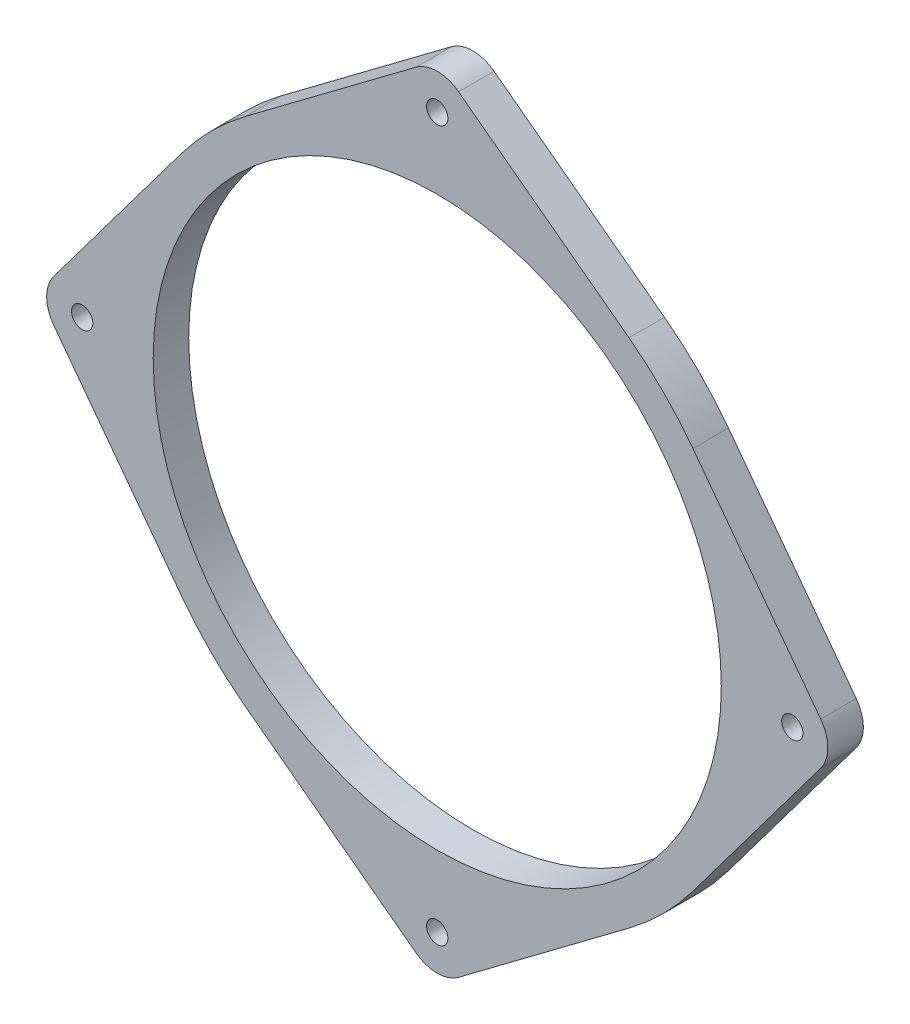
ISO-10303-21;
HEADER;
FILE_DESCRIPTION(('STEP AP214'),'2;1');
FILE_NAME('part.step','',(''),(''),'','','');
FILE_SCHEMA(('AUTOMOTIVE_DESIGN { 1 0 10303 214 1 1 1 1 }'));
ENDSEC;
DATA;
#1=APPLICATION_CONTEXT('core data for automotive mechanical design processes');
#2=APPLICATION_PROTOCOL_DEFINITION('international standard','automotive_design',2000,#1);
#3=PRODUCT_CONTEXT('',#1,'mechanical');
#4=PRODUCT('Part','Part','',(#3));
#5=PRODUCT_RELATED_PRODUCT_CATEGORY('part','',(#4));
#6=PRODUCT_DEFINITION_FORMATION('','',#4);
#7=PRODUCT_DEFINITION_CONTEXT('part definition',#1,'design');
#8=PRODUCT_DEFINITION('design','',#6,#7);
#9=PRODUCT_DEFINITION_SHAPE('','',#8);
#10=(LENGTH_UNIT() NAMED_UNIT(*) SI_UNIT(.MILLI.,.METRE.));
#11=(NAMED_UNIT(*) PLANE_ANGLE_UNIT() SI_UNIT($,.RADIAN.));
#12=(NAMED_UNIT(*) SI_UNIT($,.STERADIAN.) SOLID_ANGLE_UNIT());
#13=UNCERTAINTY_MEASURE_WITH_UNIT(LENGTH_MEASURE(1.E-05),#10,'distance_accuracy_value','');
#14=(GEOMETRIC_REPRESENTATION_CONTEXT(3) GLOBAL_UNCERTAINTY_ASSIGNED_CONTEXT((#13)) GLOBAL_UNIT_ASSIGNED_CONTEXT((#10,
#11,#12)) REPRESENTATION_CONTEXT('',''));
#15=CARTESIAN_POINT('',(0.,0.,0.));
#16=DIRECTION('',(0.,0.,1.));
#17=DIRECTION('',(1.,0.,0.));
#18=AXIS2_PLACEMENT_3D('',#15,#16,#17);
#19=CARTESIAN_POINT('',(36.,-27.,5.));
#20=DIRECTION('',(0.8,-0.6,0.));
#21=DIRECTION('',(0.6,0.8,0.));
#22=AXIS2_PLACEMENT_3D('',#19,#20,#21);
#23=PLANE('',#22);
#24=DIRECTION('',(-0.6,-0.8,0.));
#25=VECTOR('',#24,1.);
#26=CARTESIAN_POINT('',(36.,-27.,0.));
#27=LINE('',#26,#25);
#28=CARTESIAN_POINT('',(54.0000000000062,-2.9999999999918,0.));
#29=VERTEX_POINT('',#28);
#30=CARTESIAN_POINT('',(36.0000000000062,-26.9999999999918,0.));
#31=VERTEX_POINT('',#30);
#32=EDGE_CURVE('E242',#29,#31,#27,.T.);
#33=ORIENTED_EDGE('',*,*,#32,.F.);
#34=DIRECTION('',(0.,0.,-1.));
#35=VECTOR('',#34,1.);
#36=CARTESIAN_POINT('',(54.0000000000062,-2.9999999999918,5.));
#37=LINE('',#36,#35);
#38=CARTESIAN_POINT('',(54.0000000000062,-2.9999999999918,5.));
#39=VERTEX_POINT('',#38);
#40=EDGE_CURVE('E11',#39,#29,#37,.T.);
#41=ORIENTED_EDGE('',*,*,#40,.F.);
#42=DIRECTION('',(-0.6,-0.8,0.));
#43=VECTOR('',#42,1.);
#44=CARTESIAN_POINT('',(36.,-27.,5.));
#45=LINE('',#44,#43);
#46=CARTESIAN_POINT('',(36.0000000000062,-26.9999999999918,5.));
#47=VERTEX_POINT('',#46);
#48=EDGE_CURVE('E411',#39,#47,#45,.T.);
#49=ORIENTED_EDGE('',*,*,#48,.T.);
#50=DIRECTION('',(0.,0.,-1.));
#51=VECTOR('',#50,1.);
#52=CARTESIAN_POINT('',(36.0000000000062,-26.9999999999918,5.));
#53=LINE('',#52,#51);
#54=EDGE_CURVE('E115',#47,#31,#53,.T.);
#55=ORIENTED_EDGE('',*,*,#54,.T.);
#56=EDGE_LOOP('',(#33,#41,#49,#55));
#57=FACE_BOUND('',#56,.T.);
#58=ADVANCED_FACE('F39',(#57),#23,.T.);
#59=CARTESIAN_POINT('',(50.0000000000062,8.19401804060627E-12,5.));
#60=DIRECTION('',(0.,0.,-1.));
#61=DIRECTION('',(-1.,0.,0.));
#62=AXIS2_PLACEMENT_3D('',#59,#60,#61);
#63=CYLINDRICAL_SURFACE('',#62,4.99999999999999);
#64=CARTESIAN_POINT('',(50.0000000000062,8.19401804060627E-12,0.));
#65=DIRECTION('',(0.,0.,1.));
#66=DIRECTION('',(1.,0.,0.));
#67=AXIS2_PLACEMENT_3D('',#64,#65,#66);
#68=CIRCLE('',#67,4.99999999999999);
#69=CARTESIAN_POINT('',(54.0000000000062,3.00000000000819,0.));
#70=VERTEX_POINT('',#69);
#71=EDGE_CURVE('E239',#29,#70,#68,.T.);
#72=ORIENTED_EDGE('',*,*,#71,.T.);
#73=DIRECTION('',(0.,0.,-1.));
#74=VECTOR('',#73,1.);
#75=CARTESIAN_POINT('',(54.0000000000062,3.00000000000819,5.));
#76=LINE('',#75,#74);
#77=CARTESIAN_POINT('',(54.0000000000062,3.00000000000819,5.));
#78=VERTEX_POINT('',#77);
#79=EDGE_CURVE('E49',#78,#70,#76,.T.);
#80=ORIENTED_EDGE('',*,*,#79,.F.);
#81=CARTESIAN_POINT('',(50.0000000000062,8.19401804060627E-12,5.));
#82=DIRECTION('',(0.,0.,1.));
#83=DIRECTION('',(1.,0.,0.));
#84=AXIS2_PLACEMENT_3D('',#81,#82,#83);
#85=CIRCLE('',#84,4.99999999999999);
#86=EDGE_CURVE('E415',#39,#78,#85,.T.);
#87=ORIENTED_EDGE('',*,*,#86,.F.);
#88=ORIENTED_EDGE('',*,*,#40,.T.);
#89=EDGE_LOOP('',(#72,#80,#87,#88));
#90=FACE_BOUND('',#89,.T.);
#91=ADVANCED_FACE('F240',(#90),#63,.T.);
#92=CARTESIAN_POINT('',(36.0000000000079,27.0000000000059,5.));
#93=DIRECTION('',(-0.8,-0.6,0.));
#94=DIRECTION('',(0.6,-0.8,0.));
#95=AXIS2_PLACEMENT_3D('',#92,#93,#94);
#96=PLANE('',#95);
#97=DIRECTION('',(-0.6,0.8,0.));
#98=VECTOR('',#97,1.);
#99=CARTESIAN_POINT('',(36.0000000000079,27.0000000000059,0.));
#100=LINE('',#99,#98);
#101=CARTESIAN_POINT('',(36.0000000000022,27.0000000000052,0.));
#102=VERTEX_POINT('',#101);
#103=EDGE_CURVE('E233',#70,#102,#100,.T.);
#104=ORIENTED_EDGE('',*,*,#103,.T.);
#105=DIRECTION('',(0.,0.,-1.));
#106=VECTOR('',#105,1.);
#107=CARTESIAN_POINT('',(36.0000000000022,27.0000000000052,5.));
#108=LINE('',#107,#106);
#109=CARTESIAN_POINT('',(36.0000000000022,27.0000000000052,5.));
#110=VERTEX_POINT('',#109);
#111=EDGE_CURVE('E222',#110,#102,#108,.T.);
#112=ORIENTED_EDGE('',*,*,#111,.F.);
#113=DIRECTION('',(-0.6,0.8,0.));
#114=VECTOR('',#113,1.);
#115=CARTESIAN_POINT('',(36.0000000000079,27.0000000000059,5.));
#116=LINE('',#115,#114);
#117=EDGE_CURVE('E235',#78,#110,#116,.T.);
#118=ORIENTED_EDGE('',*,*,#117,.F.);
#119=ORIENTED_EDGE('',*,*,#79,.T.);
#120=EDGE_LOOP('',(#104,#112,#118,#119));
#121=FACE_BOUND('',#120,.T.);
#122=ADVANCED_FACE('F231',(#121),#96,.F.);
#123=CARTESIAN_POINT('',(0.,0.,5.));
#124=DIRECTION('',(0.,0.,-1.));
#125=DIRECTION('',(-1.,0.,0.));
#126=AXIS2_PLACEMENT_3D('',#123,#124,#125);
#127=CYLINDRICAL_SURFACE('',#126,45.);
#128=CARTESIAN_POINT('',(0.,0.,0.));
#129=DIRECTION('',(0.,0.,1.));
#130=DIRECTION('',(1.,0.,0.));
#131=AXIS2_PLACEMENT_3D('',#128,#129,#130);
#132=CIRCLE('',#131,45.);
#133=CARTESIAN_POINT('',(26.9999999999974,36.0000000000051,0.));
#134=VERTEX_POINT('',#133);
#135=EDGE_CURVE('E246',#102,#134,#132,.T.);
#136=ORIENTED_EDGE('',*,*,#135,.T.);
#137=DIRECTION('',(0.,0.,-1.));
#138=VECTOR('',#137,1.);
#139=CARTESIAN_POINT('',(26.9999999999974,36.0000000000051,5.));
#140=LINE('',#139,#138);
#141=CARTESIAN_POINT('',(26.9999999999974,36.0000000000051,5.));
#142=VERTEX_POINT('',#141);
#143=EDGE_CURVE('E219',#142,#134,#140,.T.);
#144=ORIENTED_EDGE('',*,*,#143,.F.);
#145=CARTESIAN_POINT('',(0.,0.,5.));
#146=DIRECTION('',(0.,0.,1.));
#147=DIRECTION('',(1.,0.,0.));
#148=AXIS2_PLACEMENT_3D('',#145,#146,#147);
#149=CIRCLE('',#148,45.);
#150=EDGE_CURVE('E423',#110,#142,#149,.T.);
#151=ORIENTED_EDGE('',*,*,#150,.F.);
#152=ORIENTED_EDGE('',*,*,#111,.T.);
#153=EDGE_LOOP('',(#136,#144,#151,#152));
#154=FACE_BOUND('',#153,.T.);
#155=ADVANCED_FACE('F352',(#154),#127,.T.);
#156=CARTESIAN_POINT('',(27.0000000000031,36.0000000000041,5.));
#157=DIRECTION('',(0.6,0.8,0.));
#158=DIRECTION('',(-0.8,0.6,0.));
#159=AXIS2_PLACEMENT_3D('',#156,#157,#158);
#160=PLANE('',#159);
#161=DIRECTION('',(0.8,-0.6,0.));
#162=VECTOR('',#161,1.);
#163=CARTESIAN_POINT('',(27.0000000000031,36.0000000000041,0.));
#164=LINE('',#163,#162);
#165=CARTESIAN_POINT('',(2.99999999999898,54.0000000000072,0.));
#166=VERTEX_POINT('',#165);
#167=EDGE_CURVE('E255',#166,#134,#164,.T.);
#168=ORIENTED_EDGE('',*,*,#167,.F.);
#169=DIRECTION('',(0.,0.,-1.));
#170=VECTOR('',#169,1.);
#171=CARTESIAN_POINT('',(2.99999999999898,54.0000000000072,5.));
#172=LINE('',#171,#170);
#173=CARTESIAN_POINT('',(2.99999999999898,54.0000000000072,5.));
#174=VERTEX_POINT('',#173);
#175=EDGE_CURVE('E216',#174,#166,#172,.T.);
#176=ORIENTED_EDGE('',*,*,#175,.F.);
#177=DIRECTION('',(0.8,-0.6,0.));
#178=VECTOR('',#177,1.);
#179=CARTESIAN_POINT('',(27.0000000000031,36.0000000000041,5.));
#180=LINE('',#179,#178);
#181=EDGE_CURVE('E426',#174,#142,#180,.T.);
#182=ORIENTED_EDGE('',*,*,#181,.T.);
#183=ORIENTED_EDGE('',*,*,#143,.T.);
#184=EDGE_LOOP('',(#168,#176,#182,#183));
#185=FACE_BOUND('',#184,.T.);
#186=ADVANCED_FACE('F353',(#185),#160,.T.);
#187=CARTESIAN_POINT('',(-1.00920123306442E-12,50.0000000000072,5.));
#188=DIRECTION('',(0.,0.,-1.));
#189=DIRECTION('',(-1.,0.,0.));
#190=AXIS2_PLACEMENT_3D('',#187,#188,#189);
#191=CYLINDRICAL_SURFACE('',#190,4.99999999999999);
#192=CARTESIAN_POINT('',(-1.00920123306442E-12,50.0000000000072,0.));
#193=DIRECTION('',(0.,0.,1.));
#194=DIRECTION('',(1.,0.,0.));
#195=AXIS2_PLACEMENT_3D('',#192,#193,#194);
#196=CIRCLE('',#195,4.99999999999999);
#197=CARTESIAN_POINT('',(-3.000000000001,54.0000000000072,0.));
#198=VERTEX_POINT('',#197);
#199=EDGE_CURVE('E260',#166,#198,#196,.T.);
#200=ORIENTED_EDGE('',*,*,#199,.T.);
#201=DIRECTION('',(0.,0.,-1.));
#202=VECTOR('',#201,1.);
#203=CARTESIAN_POINT('',(-3.000000000001,54.0000000000072,5.));
#204=LINE('',#203,#202);
#205=CARTESIAN_POINT('',(-3.000000000001,54.0000000000072,5.));
#206=VERTEX_POINT('',#205);
#207=EDGE_CURVE('E212',#206,#198,#204,.T.);
#208=ORIENTED_EDGE('',*,*,#207,.F.);
#209=CARTESIAN_POINT('',(-1.00920123306442E-12,50.0000000000072,5.));
#210=DIRECTION('',(0.,0.,1.));
#211=DIRECTION('',(1.,0.,0.));
#212=AXIS2_PLACEMENT_3D('',#209,#210,#211);
#213=CIRCLE('',#212,4.99999999999999);
#214=EDGE_CURVE('E431',#174,#206,#213,.T.);
#215=ORIENTED_EDGE('',*,*,#214,.F.);
#216=ORIENTED_EDGE('',*,*,#175,.T.);
#217=EDGE_LOOP('',(#200,#208,#215,#216));
#218=FACE_BOUND('',#217,.T.);
#219=ADVANCED_FACE('F356',(#218),#191,.T.);
#220=CARTESIAN_POINT('',(-27.0000000000038,36.0000000000051,5.));
#221=DIRECTION('',(0.6,-0.8,0.));
#222=DIRECTION('',(0.8,0.6,0.));
#223=AXIS2_PLACEMENT_3D('',#220,#221,#222);
#224=PLANE('',#223);
#225=DIRECTION('',(-0.8,-0.6,0.));
#226=VECTOR('',#225,1.);
#227=CARTESIAN_POINT('',(-27.0000000000038,36.0000000000051,0.));
#228=LINE('',#227,#226);
#229=CARTESIAN_POINT('',(-26.9999999999991,36.0000000000046,0.));
#230=VERTEX_POINT('',#229);
#231=EDGE_CURVE('E264',#198,#230,#228,.T.);
#232=ORIENTED_EDGE('',*,*,#231,.T.);
#233=DIRECTION('',(0.,0.,-1.));
#234=VECTOR('',#233,1.);
#235=CARTESIAN_POINT('',(-26.9999999999991,36.0000000000046,5.));
#236=LINE('',#235,#234);
#237=CARTESIAN_POINT('',(-26.9999999999991,36.0000000000046,5.));
#238=VERTEX_POINT('',#237);
#239=EDGE_CURVE('E208',#238,#230,#236,.T.);
#240=ORIENTED_EDGE('',*,*,#239,.F.);
#241=DIRECTION('',(-0.8,-0.6,0.));
#242=VECTOR('',#241,1.);
#243=CARTESIAN_POINT('',(-27.0000000000038,36.0000000000051,5.));
#244=LINE('',#243,#242);
#245=EDGE_CURVE('E435',#206,#238,#244,.T.);
#246=ORIENTED_EDGE('',*,*,#245,.F.);
#247=ORIENTED_EDGE('',*,*,#207,.T.);
#248=EDGE_LOOP('',(#232,#240,#246,#247));
#249=FACE_BOUND('',#248,.T.);
#250=ADVANCED_FACE('F360',(#249),#224,.F.);
#251=CARTESIAN_POINT('',(-36.,27.,0.));
#252=VERTEX_POINT('',#251);
#253=EDGE_CURVE('E256',#230,#252,#132,.T.);
#254=ORIENTED_EDGE('',*,*,#253,.T.);
#255=DIRECTION('',(0.,0.,-1.));
#256=VECTOR('',#255,1.);
#257=CARTESIAN_POINT('',(-36.,27.,5.));
#258=LINE('',#257,#256);
#259=CARTESIAN_POINT('',(-36.,27.,5.));
#260=VERTEX_POINT('',#259);
#261=EDGE_CURVE('E205',#260,#252,#258,.T.);
#262=ORIENTED_EDGE('',*,*,#261,.F.);
#263=EDGE_CURVE('E427',#238,#260,#149,.T.);
#264=ORIENTED_EDGE('',*,*,#263,.F.);
#265=ORIENTED_EDGE('',*,*,#239,.T.);
#266=EDGE_LOOP('',(#254,#262,#264,#265));
#267=FACE_BOUND('',#266,.T.);
#268=ADVANCED_FACE('F364',(#267),#127,.T.);
#269=CARTESIAN_POINT('',(-36.,27.,5.));
#270=DIRECTION('',(-0.8,0.6,0.));
#271=DIRECTION('',(-0.6,-0.8,0.));
#272=AXIS2_PLACEMENT_3D('',#269,#270,#271);
#273=PLANE('',#272);
#274=DIRECTION('',(0.6,0.8,0.));
#275=VECTOR('',#274,1.);
#276=CARTESIAN_POINT('',(-36.,27.,0.));
#277=LINE('',#276,#275);
#278=CARTESIAN_POINT('',(-54.,3.,0.));
#279=VERTEX_POINT('',#278);
#280=EDGE_CURVE('E268',#279,#252,#277,.T.);
#281=ORIENTED_EDGE('',*,*,#280,.F.);
#282=DIRECTION('',(0.,0.,-1.));
#283=VECTOR('',#282,1.);
#284=CARTESIAN_POINT('',(-54.,3.,5.));
#285=LINE('',#284,#283);
#286=CARTESIAN_POINT('',(-54.,3.,5.));
#287=VERTEX_POINT('',#286);
#288=EDGE_CURVE('E202',#287,#279,#285,.T.);
#289=ORIENTED_EDGE('',*,*,#288,.F.);
#290=DIRECTION('',(0.6,0.8,0.));
#291=VECTOR('',#290,1.);
#292=CARTESIAN_POINT('',(-36.,27.,5.));
#293=LINE('',#292,#291);
#294=EDGE_CURVE('E439',#287,#260,#293,.T.);
#295=ORIENTED_EDGE('',*,*,#294,.T.);
#296=ORIENTED_EDGE('',*,*,#261,.T.);
#297=EDGE_LOOP('',(#281,#289,#295,#296));
#298=FACE_BOUND('',#297,.T.);
#299=ADVANCED_FACE('F368',(#298),#273,.T.);
#300=CARTESIAN_POINT('',(-50.,0.,5.));
#301=DIRECTION('',(0.,0.,-1.));
#302=DIRECTION('',(-1.,0.,0.));
#303=AXIS2_PLACEMENT_3D('',#300,#301,#302);
#304=CYLINDRICAL_SURFACE('',#303,5.);
#305=CARTESIAN_POINT('',(-50.,0.,0.));
#306=DIRECTION('',(0.,0.,1.));
#307=DIRECTION('',(1.,0.,0.));
#308=AXIS2_PLACEMENT_3D('',#305,#306,#307);
#309=CIRCLE('',#308,5.);
#310=CARTESIAN_POINT('',(-54.,-3.,0.));
#311=VERTEX_POINT('',#310);
#312=EDGE_CURVE('E272',#279,#311,#309,.T.);
#313=ORIENTED_EDGE('',*,*,#312,.T.);
#314=DIRECTION('',(0.,0.,-1.));
#315=VECTOR('',#314,1.);
#316=CARTESIAN_POINT('',(-54.,-3.,5.));
#317=LINE('',#316,#315);
#318=CARTESIAN_POINT('',(-54.,-3.,5.));
#319=VERTEX_POINT('',#318);
#320=EDGE_CURVE('E198',#319,#311,#317,.T.);
#321=ORIENTED_EDGE('',*,*,#320,.F.);
#322=CARTESIAN_POINT('',(-50.,0.,5.));
#323=DIRECTION('',(0.,0.,1.));
#324=DIRECTION('',(1.,0.,0.));
#325=AXIS2_PLACEMENT_3D('',#322,#323,#324);
#326=CIRCLE('',#325,5.);
#327=EDGE_CURVE('E443',#287,#319,#326,.T.);
#328=ORIENTED_EDGE('',*,*,#327,.F.);
#329=ORIENTED_EDGE('',*,*,#288,.T.);
#330=EDGE_LOOP('',(#313,#321,#328,#329));
#331=FACE_BOUND('',#330,.T.);
#332=ADVANCED_FACE('F372',(#331),#304,.T.);
#333=CARTESIAN_POINT('',(-36.,-27.,5.));
#334=DIRECTION('',(0.8,0.6,0.));
#335=DIRECTION('',(-0.6,0.8,0.));
#336=AXIS2_PLACEMENT_3D('',#333,#334,#335);
#337=PLANE('',#336);
#338=DIRECTION('',(0.6,-0.8,0.));
#339=VECTOR('',#338,1.);
#340=CARTESIAN_POINT('',(-36.,-27.,0.));
#341=LINE('',#340,#339);
#342=CARTESIAN_POINT('',(-36.,-27.,0.));
#343=VERTEX_POINT('',#342);
#344=EDGE_CURVE('E276',#311,#343,#341,.T.);
#345=ORIENTED_EDGE('',*,*,#344,.T.);
#346=DIRECTION('',(0.,0.,-1.));
#347=VECTOR('',#346,1.);
#348=CARTESIAN_POINT('',(-36.,-27.,5.));
#349=LINE('',#348,#347);
#350=CARTESIAN_POINT('',(-36.,-27.,5.));
#351=VERTEX_POINT('',#350);
#352=EDGE_CURVE('E194',#351,#343,#349,.T.);
#353=ORIENTED_EDGE('',*,*,#352,.F.);
#354=DIRECTION('',(0.6,-0.8,0.));
#355=VECTOR('',#354,1.);
#356=CARTESIAN_POINT('',(-36.,-27.,5.));
#357=LINE('',#356,#355);
#358=EDGE_CURVE('E447',#319,#351,#357,.T.);
#359=ORIENTED_EDGE('',*,*,#358,.F.);
#360=ORIENTED_EDGE('',*,*,#320,.T.);
#361=EDGE_LOOP('',(#345,#353,#359,#360));
#362=FACE_BOUND('',#361,.T.);
#363=ADVANCED_FACE('F376',(#362),#337,.F.);
#364=CARTESIAN_POINT('',(0.,0.,5.));
#365=DIRECTION('',(0.,0.,-1.));
#366=DIRECTION('',(-1.,0.,0.));
#367=AXIS2_PLACEMENT_3D('',#364,#365,#366);
#368=CYLINDRICAL_SURFACE('',#367,45.);
#369=CARTESIAN_POINT('',(0.,0.,0.));
#370=DIRECTION('',(0.,0.,1.));
#371=DIRECTION('',(1.,0.,0.));
#372=AXIS2_PLACEMENT_3D('',#369,#370,#371);
#373=CIRCLE('',#372,45.);
#374=CARTESIAN_POINT('',(-26.9999999999943,-36.000000000001,0.));
#375=VERTEX_POINT('',#374);
#376=EDGE_CURVE('E280',#343,#375,#373,.T.);
#377=ORIENTED_EDGE('',*,*,#376,.T.);
#378=DIRECTION('',(0.,0.,-1.));
#379=VECTOR('',#378,1.);
#380=CARTESIAN_POINT('',(-26.9999999999943,-36.000000000001,5.));
#381=LINE('',#380,#379);
#382=CARTESIAN_POINT('',(-26.9999999999943,-36.000000000001,5.));
#383=VERTEX_POINT('',#382);
#384=EDGE_CURVE('E187',#383,#375,#381,.T.);
#385=ORIENTED_EDGE('',*,*,#384,.F.);
#386=CARTESIAN_POINT('',(0.,0.,5.));
#387=DIRECTION('',(0.,0.,1.));
#388=DIRECTION('',(1.,0.,0.));
#389=AXIS2_PLACEMENT_3D('',#386,#387,#388);
#390=CIRCLE('',#389,45.);
#391=EDGE_CURVE('E451',#351,#383,#390,.T.);
#392=ORIENTED_EDGE('',*,*,#391,.F.);
#393=ORIENTED_EDGE('',*,*,#352,.T.);
#394=EDGE_LOOP('',(#377,#385,#392,#393));
#395=FACE_BOUND('',#394,.T.);
#396=ADVANCED_FACE('F341',(#395),#368,.T.);
#397=CARTESIAN_POINT('',(-26.9999999999969,-35.9999999999959,5.));
#398=DIRECTION('',(-0.6,-0.8,0.));
#399=DIRECTION('',(0.8,-0.6,0.));
#400=AXIS2_PLACEMENT_3D('',#397,#398,#399);
#401=PLANE('',#400);
#402=DIRECTION('',(-0.8,0.6,0.));
#403=VECTOR('',#402,1.);
#404=CARTESIAN_POINT('',(-26.9999999999969,-35.9999999999959,0.));
#405=LINE('',#404,#403);
#406=CARTESIAN_POINT('',(-2.9999999999928,-53.999999999999,0.));
#407=VERTEX_POINT('',#406);
#408=EDGE_CURVE('E284',#407,#375,#405,.T.);
#409=ORIENTED_EDGE('',*,*,#408,.F.);
#410=DIRECTION('',(0.,0.,-1.));
#411=VECTOR('',#410,1.);
#412=CARTESIAN_POINT('',(-2.9999999999928,-53.999999999999,5.));
#413=LINE('',#412,#411);
#414=CARTESIAN_POINT('',(-2.9999999999928,-53.999999999999,5.));
#415=VERTEX_POINT('',#414);
#416=EDGE_CURVE('E183',#415,#407,#413,.T.);
#417=ORIENTED_EDGE('',*,*,#416,.F.);
#418=DIRECTION('',(-0.8,0.6,0.));
#419=VECTOR('',#418,1.);
#420=CARTESIAN_POINT('',(-26.9999999999969,-35.9999999999959,5.));
#421=LINE('',#420,#419);
#422=EDGE_CURVE('E175',#415,#383,#421,.T.);
#423=ORIENTED_EDGE('',*,*,#422,.T.);
#424=ORIENTED_EDGE('',*,*,#384,.T.);
#425=EDGE_LOOP('',(#409,#417,#423,#424));
#426=FACE_BOUND('',#425,.T.);
#427=ADVANCED_FACE('F381',(#426),#401,.T.);
#428=CARTESIAN_POINT('',(7.19094004153759E-12,-49.999999999999,5.));
#429=DIRECTION('',(0.,0.,-1.));
#430=DIRECTION('',(-1.,0.,0.));
#431=AXIS2_PLACEMENT_3D('',#428,#429,#430);
#432=CYLINDRICAL_SURFACE('',#431,4.99999999999999);
#433=CARTESIAN_POINT('',(7.19094004153759E-12,-49.999999999999,0.));
#434=DIRECTION('',(0.,0.,1.));
#435=DIRECTION('',(1.,0.,0.));
#436=AXIS2_PLACEMENT_3D('',#433,#434,#435);
#437=CIRCLE('',#436,4.99999999999999);
#438=CARTESIAN_POINT('',(3.00000000000718,-53.999999999999,0.));
#439=VERTEX_POINT('',#438);
#440=EDGE_CURVE('E181',#407,#439,#437,.T.);
#441=ORIENTED_EDGE('',*,*,#440,.T.);
#442=DIRECTION('',(0.,0.,-1.));
#443=VECTOR('',#442,1.);
#444=CARTESIAN_POINT('',(3.00000000000718,-53.999999999999,5.));
#445=LINE('',#444,#443);
#446=CARTESIAN_POINT('',(3.00000000000718,-53.999999999999,5.));
#447=VERTEX_POINT('',#446);
#448=EDGE_CURVE('E164',#447,#439,#445,.T.);
#449=ORIENTED_EDGE('',*,*,#448,.F.);
#450=CARTESIAN_POINT('',(7.19094004153759E-12,-49.999999999999,5.));
#451=DIRECTION('',(0.,0.,1.));
#452=DIRECTION('',(1.,0.,0.));
#453=AXIS2_PLACEMENT_3D('',#450,#451,#452);
#454=CIRCLE('',#453,4.99999999999999);
#455=EDGE_CURVE('E168',#415,#447,#454,.T.);
#456=ORIENTED_EDGE('',*,*,#455,.F.);
#457=ORIENTED_EDGE('',*,*,#416,.T.);
#458=EDGE_LOOP('',(#441,#449,#456,#457));
#459=FACE_BOUND('',#458,.T.);
#460=ADVANCED_FACE('F179',(#459),#432,.T.);
#461=CARTESIAN_POINT('',(27.0000000000021,-36.0000000000028,5.));
#462=DIRECTION('',(-0.6,0.8,0.));
#463=DIRECTION('',(-0.8,-0.6,0.));
#464=AXIS2_PLACEMENT_3D('',#461,#462,#463);
#465=PLANE('',#464);
#466=DIRECTION('',(0.8,0.6,0.));
#467=VECTOR('',#466,1.);
#468=CARTESIAN_POINT('',(27.0000000000021,-36.0000000000028,0.));
#469=LINE('',#468,#467);
#470=CARTESIAN_POINT('',(27.0000000000061,-35.9999999999976,0.));
#471=VERTEX_POINT('',#470);
#472=EDGE_CURVE('E290',#439,#471,#469,.T.);
#473=ORIENTED_EDGE('',*,*,#472,.T.);
#474=DIRECTION('',(0.,0.,-1.));
#475=VECTOR('',#474,1.);
#476=CARTESIAN_POINT('',(27.0000000000061,-35.9999999999976,5.));
#477=LINE('',#476,#475);
#478=CARTESIAN_POINT('',(27.0000000000061,-35.9999999999976,5.));
#479=VERTEX_POINT('',#478);
#480=EDGE_CURVE('E166',#479,#471,#477,.T.);
#481=ORIENTED_EDGE('',*,*,#480,.F.);
#482=DIRECTION('',(0.8,0.6,0.));
#483=VECTOR('',#482,1.);
#484=CARTESIAN_POINT('',(27.0000000000021,-36.0000000000028,5.));
#485=LINE('',#484,#483);
#486=EDGE_CURVE('E159',#447,#479,#485,.T.);
#487=ORIENTED_EDGE('',*,*,#486,.F.);
#488=ORIENTED_EDGE('',*,*,#448,.T.);
#489=EDGE_LOOP('',(#473,#481,#487,#488));
#490=FACE_BOUND('',#489,.T.);
#491=ADVANCED_FACE('F162',(#490),#465,.F.);
#492=CARTESIAN_POINT('',(-1.00920123306442E-12,50.0000000000072,5.));
#493=DIRECTION('',(0.,0.,-1.));
#494=DIRECTION('',(-1.,0.,0.));
#495=AXIS2_PLACEMENT_3D('',#492,#493,#494);
#496=CYLINDRICAL_SURFACE('',#495,1.50000000000722);
#497=CARTESIAN_POINT('',(-1.00920123306442E-12,50.0000000000072,5.));
#498=DIRECTION('',(0.,0.,1.));
#499=DIRECTION('',(1.,0.,0.));
#500=AXIS2_PLACEMENT_3D('',#497,#498,#499);
#501=CIRCLE('',#500,1.50000000000722);
#502=CARTESIAN_POINT('',(1.50000000000621,50.0000000000072,5.));
#503=VERTEX_POINT('',#502);
#504=EDGE_CURVE('E309',#503,#503,#501,.T.);
#505=ORIENTED_EDGE('',*,*,#504,.T.);
#506=EDGE_LOOP('',(#505));
#507=FACE_BOUND('',#506,.T.);
#508=CARTESIAN_POINT('',(-1.00920123306442E-12,50.0000000000072,0.));
#509=DIRECTION('',(0.,0.,1.));
#510=DIRECTION('',(1.,0.,0.));
#511=AXIS2_PLACEMENT_3D('',#508,#509,#510);
#512=CIRCLE('',#511,1.50000000000722);
#513=CARTESIAN_POINT('',(1.50000000000621,50.0000000000072,0.));
#514=VERTEX_POINT('',#513);
#515=EDGE_CURVE('E297',#514,#514,#512,.T.);
#516=ORIENTED_EDGE('',*,*,#515,.F.);
#517=EDGE_LOOP('',(#516));
#518=FACE_BOUND('',#517,.T.);
#519=ADVANCED_FACE('F388',(#507,#518),#496,.F.);
#520=CARTESIAN_POINT('',(0.,0.,5.));
#521=DIRECTION('',(0.,0.,-1.));
#522=DIRECTION('',(-1.,0.,0.));
#523=AXIS2_PLACEMENT_3D('',#520,#521,#522);
#524=CYLINDRICAL_SURFACE('',#523,40.);
#525=CARTESIAN_POINT('',(0.,0.,5.));
#526=DIRECTION('',(0.,0.,1.));
#527=DIRECTION('',(1.,0.,0.));
#528=AXIS2_PLACEMENT_3D('',#525,#526,#527);
#529=CIRCLE('',#528,40.);
#530=CARTESIAN_POINT('',(40.,0.,5.));
#531=VERTEX_POINT('',#530);
#532=EDGE_CURVE('E315',#531,#531,#529,.T.);
#533=ORIENTED_EDGE('',*,*,#532,.T.);
#534=EDGE_LOOP('',(#533));
#535=FACE_BOUND('',#534,.T.);
#536=CARTESIAN_POINT('',(0.,0.,0.));
#537=DIRECTION('',(0.,0.,1.));
#538=DIRECTION('',(1.,0.,0.));
#539=AXIS2_PLACEMENT_3D('',#536,#537,#538);
#540=CIRCLE('',#539,40.);
#541=CARTESIAN_POINT('',(40.,0.,0.));
#542=VERTEX_POINT('',#541);
#543=EDGE_CURVE('E293',#542,#542,#540,.T.);
#544=ORIENTED_EDGE('',*,*,#543,.F.);
#545=EDGE_LOOP('',(#544));
#546=FACE_BOUND('',#545,.T.);
#547=ADVANCED_FACE('F338',(#535,#546),#524,.F.);
#548=EDGE_CURVE('E108',#471,#31,#373,.T.);
#549=ORIENTED_EDGE('',*,*,#548,.T.);
#550=ORIENTED_EDGE('',*,*,#54,.F.);
#551=EDGE_CURVE('E57',#479,#47,#390,.T.);
#552=ORIENTED_EDGE('',*,*,#551,.F.);
#553=ORIENTED_EDGE('',*,*,#480,.T.);
#554=EDGE_LOOP('',(#549,#550,#552,#553));
#555=FACE_BOUND('',#554,.T.);
#556=ADVANCED_FACE('F330',(#555),#368,.T.);
#557=CARTESIAN_POINT('',(50.0000000000062,8.19401804060627E-12,5.));
#558=DIRECTION('',(0.,0.,-1.));
#559=DIRECTION('',(-1.,0.,0.));
#560=AXIS2_PLACEMENT_3D('',#557,#558,#559);
#561=CYLINDRICAL_SURFACE('',#560,1.50000000000842);
#562=CARTESIAN_POINT('',(50.0000000000062,8.19401804060627E-12,5.));
#563=DIRECTION('',(0.,0.,1.));
#564=DIRECTION('',(1.,0.,0.));
#565=AXIS2_PLACEMENT_3D('',#562,#563,#564);
#566=CIRCLE('',#565,1.50000000000842);
#567=CARTESIAN_POINT('',(51.5000000000146,8.19401804060627E-12,5.));
#568=VERTEX_POINT('',#567);
#569=EDGE_CURVE('E409',#568,#568,#566,.T.);
#570=ORIENTED_EDGE('',*,*,#569,.T.);
#571=EDGE_LOOP('',(#570));
#572=FACE_BOUND('',#571,.T.);
#573=CARTESIAN_POINT('',(50.0000000000062,8.19401804060627E-12,0.));
#574=DIRECTION('',(0.,0.,1.));
#575=DIRECTION('',(1.,0.,0.));
#576=AXIS2_PLACEMENT_3D('',#573,#574,#575);
#577=CIRCLE('',#576,1.50000000000842);
#578=CARTESIAN_POINT('',(51.5000000000146,8.19401804060627E-12,0.));
#579=VERTEX_POINT('',#578);
#580=EDGE_CURVE('E248',#579,#579,#577,.T.);
#581=ORIENTED_EDGE('',*,*,#580,.F.);
#582=EDGE_LOOP('',(#581));
#583=FACE_BOUND('',#582,.T.);
#584=ADVANCED_FACE('F328',(#572,#583),#561,.F.);
#585=CARTESIAN_POINT('',(-50.,0.,5.));
#586=DIRECTION('',(0.,0.,-1.));
#587=DIRECTION('',(-1.,0.,0.));
#588=AXIS2_PLACEMENT_3D('',#585,#586,#587);
#589=CYLINDRICAL_SURFACE('',#588,1.5);
#590=CARTESIAN_POINT('',(-50.,0.,5.));
#591=DIRECTION('',(0.,0.,1.));
#592=DIRECTION('',(1.,0.,0.));
#593=AXIS2_PLACEMENT_3D('',#590,#591,#592);
#594=CIRCLE('',#593,1.5);
#595=CARTESIAN_POINT('',(-48.5,0.,5.));
#596=VERTEX_POINT('',#595);
#597=EDGE_CURVE('E304',#596,#596,#594,.T.);
#598=ORIENTED_EDGE('',*,*,#597,.T.);
#599=EDGE_LOOP('',(#598));
#600=FACE_BOUND('',#599,.T.);
#601=CARTESIAN_POINT('',(-50.,0.,0.));
#602=DIRECTION('',(0.,0.,1.));
#603=DIRECTION('',(1.,0.,0.));
#604=AXIS2_PLACEMENT_3D('',#601,#602,#603);
#605=CIRCLE('',#604,1.5);
#606=CARTESIAN_POINT('',(-48.5,0.,0.));
#607=VERTEX_POINT('',#606);
#608=EDGE_CURVE('E319',#607,#607,#605,.T.);
#609=ORIENTED_EDGE('',*,*,#608,.F.);
#610=EDGE_LOOP('',(#609));
#611=FACE_BOUND('',#610,.T.);
#612=ADVANCED_FACE('F41',(#600,#611),#589,.F.);
#613=CARTESIAN_POINT('',(7.19094004153759E-12,-49.999999999999,5.));
#614=DIRECTION('',(0.,0.,-1.));
#615=DIRECTION('',(-1.,0.,0.));
#616=AXIS2_PLACEMENT_3D('',#613,#614,#615);
#617=CYLINDRICAL_SURFACE('',#616,1.50000000000131);
#618=CARTESIAN_POINT('',(7.19094004153759E-12,-49.999999999999,5.));
#619=DIRECTION('',(0.,0.,1.));
#620=DIRECTION('',(1.,0.,0.));
#621=AXIS2_PLACEMENT_3D('',#618,#619,#620);
#622=CIRCLE('',#621,1.50000000000131);
#623=CARTESIAN_POINT('',(1.5000000000085,-49.999999999999,5.));
#624=VERTEX_POINT('',#623);
#625=EDGE_CURVE('E306',#624,#624,#622,.T.);
#626=ORIENTED_EDGE('',*,*,#625,.T.);
#627=EDGE_LOOP('',(#626));
#628=FACE_BOUND('',#627,.T.);
#629=CARTESIAN_POINT('',(7.19094004153759E-12,-49.999999999999,0.));
#630=DIRECTION('',(0.,0.,1.));
#631=DIRECTION('',(1.,0.,0.));
#632=AXIS2_PLACEMENT_3D('',#629,#630,#631);
#633=CIRCLE('',#632,1.50000000000131);
#634=CARTESIAN_POINT('',(1.5000000000085,-49.999999999999,0.));
#635=VERTEX_POINT('',#634);
#636=EDGE_CURVE('E301',#635,#635,#633,.T.);
#637=ORIENTED_EDGE('',*,*,#636,.F.);
#638=EDGE_LOOP('',(#637));
#639=FACE_BOUND('',#638,.T.);
#640=ADVANCED_FACE('F336',(#628,#639),#617,.F.);
#641=CARTESIAN_POINT('',(0.,0.,5.));
#642=DIRECTION('',(0.,0.,1.));
#643=DIRECTION('',(1.,0.,0.));
#644=AXIS2_PLACEMENT_3D('',#641,#642,#643);
#645=PLANE('',#644);
#646=ORIENTED_EDGE('',*,*,#597,.F.);
#647=EDGE_LOOP('',(#646));
#648=FACE_BOUND('',#647,.T.);
#649=ORIENTED_EDGE('',*,*,#569,.F.);
#650=EDGE_LOOP('',(#649));
#651=FACE_BOUND('',#650,.T.);
#652=ORIENTED_EDGE('',*,*,#48,.F.);
#653=ORIENTED_EDGE('',*,*,#86,.T.);
#654=ORIENTED_EDGE('',*,*,#117,.T.);
#655=ORIENTED_EDGE('',*,*,#150,.T.);
#656=ORIENTED_EDGE('',*,*,#181,.F.);
#657=ORIENTED_EDGE('',*,*,#214,.T.);
#658=ORIENTED_EDGE('',*,*,#245,.T.);
#659=ORIENTED_EDGE('',*,*,#263,.T.);
#660=ORIENTED_EDGE('',*,*,#294,.F.);
#661=ORIENTED_EDGE('',*,*,#327,.T.);
#662=ORIENTED_EDGE('',*,*,#358,.T.);
#663=ORIENTED_EDGE('',*,*,#391,.T.);
#664=ORIENTED_EDGE('',*,*,#422,.F.);
#665=ORIENTED_EDGE('',*,*,#455,.T.);
#666=ORIENTED_EDGE('',*,*,#486,.T.);
#667=ORIENTED_EDGE('',*,*,#551,.T.);
#668=EDGE_LOOP('',(#652,#653,#654,#655,#656,#657,#658,#659,#660,#661,#662,#663,#664,#665,#666,#667));
#669=FACE_BOUND('',#668,.T.);
#670=ORIENTED_EDGE('',*,*,#532,.F.);
#671=EDGE_LOOP('',(#670));
#672=FACE_BOUND('',#671,.T.);
#673=ORIENTED_EDGE('',*,*,#504,.F.);
#674=EDGE_LOOP('',(#673));
#675=FACE_BOUND('',#674,.T.);
#676=ORIENTED_EDGE('',*,*,#625,.F.);
#677=EDGE_LOOP('',(#676));
#678=FACE_BOUND('',#677,.T.);
#679=ADVANCED_FACE('F172',(#648,#651,#669,#672,#675,#678),#645,.T.);
#680=CARTESIAN_POINT('',(0.,0.,0.));
#681=DIRECTION('',(0.,0.,1.));
#682=DIRECTION('',(1.,0.,0.));
#683=AXIS2_PLACEMENT_3D('',#680,#681,#682);
#684=PLANE('',#683);
#685=ORIENTED_EDGE('',*,*,#608,.T.);
#686=EDGE_LOOP('',(#685));
#687=FACE_BOUND('',#686,.T.);
#688=ORIENTED_EDGE('',*,*,#580,.T.);
#689=EDGE_LOOP('',(#688));
#690=FACE_BOUND('',#689,.T.);
#691=ORIENTED_EDGE('',*,*,#32,.T.);
#692=ORIENTED_EDGE('',*,*,#548,.F.);
#693=ORIENTED_EDGE('',*,*,#472,.F.);
#694=ORIENTED_EDGE('',*,*,#440,.F.);
#695=ORIENTED_EDGE('',*,*,#408,.T.);
#696=ORIENTED_EDGE('',*,*,#376,.F.);
#697=ORIENTED_EDGE('',*,*,#344,.F.);
#698=ORIENTED_EDGE('',*,*,#312,.F.);
#699=ORIENTED_EDGE('',*,*,#280,.T.);
#700=ORIENTED_EDGE('',*,*,#253,.F.);
#701=ORIENTED_EDGE('',*,*,#231,.F.);
#702=ORIENTED_EDGE('',*,*,#199,.F.);
#703=ORIENTED_EDGE('',*,*,#167,.T.);
#704=ORIENTED_EDGE('',*,*,#135,.F.);
#705=ORIENTED_EDGE('',*,*,#103,.F.);
#706=ORIENTED_EDGE('',*,*,#71,.F.);
#707=EDGE_LOOP('',(#691,#692,#693,#694,#695,#696,#697,#698,#699,#700,#701,#702,#703,#704,#705,#706));
#708=FACE_BOUND('',#707,.T.);
#709=ORIENTED_EDGE('',*,*,#543,.T.);
#710=EDGE_LOOP('',(#709));
#711=FACE_BOUND('',#710,.T.);
#712=ORIENTED_EDGE('',*,*,#515,.T.);
#713=EDGE_LOOP('',(#712));
#714=FACE_BOUND('',#713,.T.);
#715=ORIENTED_EDGE('',*,*,#636,.T.);
#716=EDGE_LOOP('',(#715));
#717=FACE_BOUND('',#716,.T.);
#718=ADVANCED_FACE('F326',(#687,#690,#708,#711,#714,#717),#684,.F.);
#719=CLOSED_SHELL('',(#58,#91,#122,#155,#186,#219,#250,#268,#299,#332,#363,#396,#427,#460,#491,
#519,#547,#556,#584,#612,#640,#679,#718));
#720=MANIFOLD_SOLID_BREP('B2',#719);
#721=ADVANCED_BREP_SHAPE_REPRESENTATION('',(#18,#720),#14);
#722=SHAPE_DEFINITION_REPRESENTATION(#9,#721);
ENDSEC;
END-ISO-10303-21;
